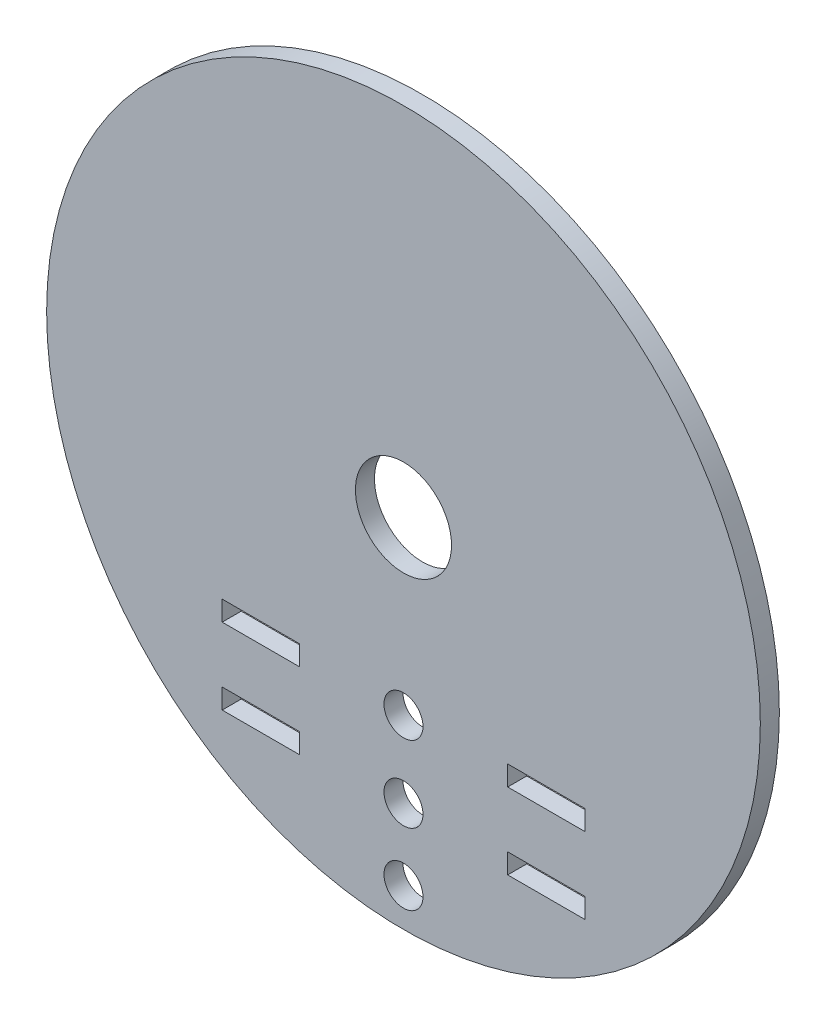
ISO-10303-21;
HEADER;
FILE_DESCRIPTION(('STEP AP214'),'2;1');
FILE_NAME('part.step','',(''),(''),'','','');
FILE_SCHEMA(('AUTOMOTIVE_DESIGN { 1 0 10303 214 1 1 1 1 }'));
ENDSEC;
DATA;
#1=APPLICATION_CONTEXT('core data for automotive mechanical design processes');
#2=APPLICATION_PROTOCOL_DEFINITION('international standard','automotive_design',2000,#1);
#3=PRODUCT_CONTEXT('',#1,'mechanical');
#4=PRODUCT('Part','Part','',(#3));
#5=PRODUCT_RELATED_PRODUCT_CATEGORY('part','',(#4));
#6=PRODUCT_DEFINITION_FORMATION('','',#4);
#7=PRODUCT_DEFINITION_CONTEXT('part definition',#1,'design');
#8=PRODUCT_DEFINITION('design','',#6,#7);
#9=PRODUCT_DEFINITION_SHAPE('','',#8);
#10=(LENGTH_UNIT() NAMED_UNIT(*) SI_UNIT(.MILLI.,.METRE.));
#11=(NAMED_UNIT(*) PLANE_ANGLE_UNIT() SI_UNIT($,.RADIAN.));
#12=(NAMED_UNIT(*) SI_UNIT($,.STERADIAN.) SOLID_ANGLE_UNIT());
#13=UNCERTAINTY_MEASURE_WITH_UNIT(LENGTH_MEASURE(1.E-05),#10,'distance_accuracy_value','');
#14=(GEOMETRIC_REPRESENTATION_CONTEXT(3) GLOBAL_UNCERTAINTY_ASSIGNED_CONTEXT((#13)) GLOBAL_UNIT_ASSIGNED_CONTEXT((#10,
#11,#12)) REPRESENTATION_CONTEXT('',''));
#15=CARTESIAN_POINT('',(0.,0.,0.));
#16=DIRECTION('',(0.,0.,1.));
#17=DIRECTION('',(1.,0.,0.));
#18=AXIS2_PLACEMENT_3D('',#15,#16,#17);
#19=CARTESIAN_POINT('',(0.,26.,2.));
#20=DIRECTION('',(0.,0.,1.));
#21=DIRECTION('',(1.,0.,0.));
#22=AXIS2_PLACEMENT_3D('',#19,#20,#21);
#23=PLANE('',#22);
#24=CARTESIAN_POINT('',(0.,-7.5,2.));
#25=DIRECTION('',(0.,0.,1.));
#26=DIRECTION('',(1.,0.,0.));
#27=AXIS2_PLACEMENT_3D('',#24,#25,#26);
#28=CIRCLE('',#27,2.05);
#29=CARTESIAN_POINT('',(2.05,-7.5,2.));
#30=VERTEX_POINT('',#29);
#31=EDGE_CURVE('E177',#30,#30,#28,.T.);
#32=ORIENTED_EDGE('',*,*,#31,.F.);
#33=EDGE_LOOP('',(#32));
#34=FACE_BOUND('',#33,.T.);
#35=CARTESIAN_POINT('',(0.,0.,2.));
#36=DIRECTION('',(0.,0.,1.));
#37=DIRECTION('',(1.,0.,0.));
#38=AXIS2_PLACEMENT_3D('',#35,#36,#37);
#39=CIRCLE('',#38,2.05);
#40=CARTESIAN_POINT('',(2.05,0.,2.));
#41=VERTEX_POINT('',#40);
#42=EDGE_CURVE('E286',#41,#41,#39,.T.);
#43=ORIENTED_EDGE('',*,*,#42,.F.);
#44=EDGE_LOOP('',(#43));
#45=FACE_BOUND('',#44,.T.);
#46=CARTESIAN_POINT('',(0.,26.,2.));
#47=DIRECTION('',(0.,0.,1.));
#48=DIRECTION('',(1.,0.,0.));
#49=AXIS2_PLACEMENT_3D('',#46,#47,#48);
#50=CIRCLE('',#49,37.5);
#51=CARTESIAN_POINT('',(37.5,26.,2.));
#52=VERTEX_POINT('',#51);
#53=EDGE_CURVE('E11',#52,#52,#50,.T.);
#54=ORIENTED_EDGE('',*,*,#53,.T.);
#55=EDGE_LOOP('',(#54));
#56=FACE_BOUND('',#55,.T.);
#57=CARTESIAN_POINT('',(0.,8.,2.));
#58=DIRECTION('',(0.,0.,1.));
#59=DIRECTION('',(1.,0.,0.));
#60=AXIS2_PLACEMENT_3D('',#57,#58,#59);
#61=CIRCLE('',#60,2.05);
#62=CARTESIAN_POINT('',(2.05,8.,2.));
#63=VERTEX_POINT('',#62);
#64=EDGE_CURVE('E280',#63,#63,#61,.T.);
#65=ORIENTED_EDGE('',*,*,#64,.F.);
#66=EDGE_LOOP('',(#65));
#67=FACE_BOUND('',#66,.T.);
#68=DIRECTION('',(-1.,0.,0.));
#69=VECTOR('',#68,1.);
#70=CARTESIAN_POINT('',(-19.05,9.05,2.));
#71=LINE('',#70,#69);
#72=CARTESIAN_POINT('',(-10.95,9.05,2.));
#73=VERTEX_POINT('',#72);
#74=CARTESIAN_POINT('',(-19.05,9.05,2.));
#75=VERTEX_POINT('',#74);
#76=EDGE_CURVE('E251',#73,#75,#71,.T.);
#77=ORIENTED_EDGE('',*,*,#76,.F.);
#78=DIRECTION('',(0.,1.,0.));
#79=VECTOR('',#78,1.);
#80=CARTESIAN_POINT('',(-10.95,9.05,2.));
#81=LINE('',#80,#79);
#82=CARTESIAN_POINT('',(-10.95,6.95,2.));
#83=VERTEX_POINT('',#82);
#84=EDGE_CURVE('E249',#83,#73,#81,.T.);
#85=ORIENTED_EDGE('',*,*,#84,.F.);
#86=DIRECTION('',(1.,0.,0.));
#87=VECTOR('',#86,1.);
#88=CARTESIAN_POINT('',(-19.05,6.95,2.));
#89=LINE('',#88,#87);
#90=CARTESIAN_POINT('',(-19.05,6.95,2.));
#91=VERTEX_POINT('',#90);
#92=EDGE_CURVE('E257',#91,#83,#89,.T.);
#93=ORIENTED_EDGE('',*,*,#92,.F.);
#94=DIRECTION('',(0.,-1.,0.));
#95=VECTOR('',#94,1.);
#96=CARTESIAN_POINT('',(-19.05,9.05,2.));
#97=LINE('',#96,#95);
#98=EDGE_CURVE('E254',#75,#91,#97,.T.);
#99=ORIENTED_EDGE('',*,*,#98,.F.);
#100=EDGE_LOOP('',(#77,#85,#93,#99));
#101=FACE_BOUND('',#100,.T.);
#102=DIRECTION('',(0.,1.,0.));
#103=VECTOR('',#102,1.);
#104=CARTESIAN_POINT('',(-10.95,-1.05,2.));
#105=LINE('',#104,#103);
#106=CARTESIAN_POINT('',(-10.95,-1.05,2.));
#107=VERTEX_POINT('',#106);
#108=CARTESIAN_POINT('',(-10.95,1.05,2.));
#109=VERTEX_POINT('',#108);
#110=EDGE_CURVE('E220',#107,#109,#105,.T.);
#111=ORIENTED_EDGE('',*,*,#110,.F.);
#112=DIRECTION('',(1.,0.,0.));
#113=VECTOR('',#112,1.);
#114=CARTESIAN_POINT('',(-19.05,-1.05,2.));
#115=LINE('',#114,#113);
#116=CARTESIAN_POINT('',(-19.05,-1.05,2.));
#117=VERTEX_POINT('',#116);
#118=EDGE_CURVE('E218',#117,#107,#115,.T.);
#119=ORIENTED_EDGE('',*,*,#118,.F.);
#120=DIRECTION('',(0.,-1.,0.));
#121=VECTOR('',#120,1.);
#122=CARTESIAN_POINT('',(-19.05,-1.05,2.));
#123=LINE('',#122,#121);
#124=CARTESIAN_POINT('',(-19.05,1.05,2.));
#125=VERTEX_POINT('',#124);
#126=EDGE_CURVE('E226',#125,#117,#123,.T.);
#127=ORIENTED_EDGE('',*,*,#126,.F.);
#128=DIRECTION('',(-1.,0.,0.));
#129=VECTOR('',#128,1.);
#130=CARTESIAN_POINT('',(-19.05,1.05,2.));
#131=LINE('',#130,#129);
#132=EDGE_CURVE('E223',#109,#125,#131,.T.);
#133=ORIENTED_EDGE('',*,*,#132,.F.);
#134=EDGE_LOOP('',(#111,#119,#127,#133));
#135=FACE_BOUND('',#134,.T.);
#136=DIRECTION('',(0.,-1.,0.));
#137=VECTOR('',#136,1.);
#138=CARTESIAN_POINT('',(10.95,9.05,2.));
#139=LINE('',#138,#137);
#140=CARTESIAN_POINT('',(10.95,9.05,2.));
#141=VERTEX_POINT('',#140);
#142=CARTESIAN_POINT('',(10.95,6.95,2.));
#143=VERTEX_POINT('',#142);
#144=EDGE_CURVE('E189',#141,#143,#139,.T.);
#145=ORIENTED_EDGE('',*,*,#144,.F.);
#146=DIRECTION('',(-1.,0.,0.));
#147=VECTOR('',#146,1.);
#148=CARTESIAN_POINT('',(19.05,9.05,2.));
#149=LINE('',#148,#147);
#150=CARTESIAN_POINT('',(19.05,9.05,2.));
#151=VERTEX_POINT('',#150);
#152=EDGE_CURVE('E187',#151,#141,#149,.T.);
#153=ORIENTED_EDGE('',*,*,#152,.F.);
#154=DIRECTION('',(0.,1.,0.));
#155=VECTOR('',#154,1.);
#156=CARTESIAN_POINT('',(19.05,9.05,2.));
#157=LINE('',#156,#155);
#158=CARTESIAN_POINT('',(19.05,6.95,2.));
#159=VERTEX_POINT('',#158);
#160=EDGE_CURVE('E195',#159,#151,#157,.T.);
#161=ORIENTED_EDGE('',*,*,#160,.F.);
#162=DIRECTION('',(1.,0.,0.));
#163=VECTOR('',#162,1.);
#164=CARTESIAN_POINT('',(19.05,6.95,2.));
#165=LINE('',#164,#163);
#166=EDGE_CURVE('E192',#143,#159,#165,.T.);
#167=ORIENTED_EDGE('',*,*,#166,.F.);
#168=EDGE_LOOP('',(#145,#153,#161,#167));
#169=FACE_BOUND('',#168,.T.);
#170=DIRECTION('',(-1.,0.,0.));
#171=VECTOR('',#170,1.);
#172=CARTESIAN_POINT('',(19.05,1.05,2.));
#173=LINE('',#172,#171);
#174=CARTESIAN_POINT('',(19.05,1.05,2.));
#175=VERTEX_POINT('',#174);
#176=CARTESIAN_POINT('',(10.95,1.05,2.));
#177=VERTEX_POINT('',#176);
#178=EDGE_CURVE('E156',#175,#177,#173,.T.);
#179=ORIENTED_EDGE('',*,*,#178,.F.);
#180=DIRECTION('',(0.,1.,0.));
#181=VECTOR('',#180,1.);
#182=CARTESIAN_POINT('',(19.05,-1.05,2.));
#183=LINE('',#182,#181);
#184=CARTESIAN_POINT('',(19.05,-1.05,2.));
#185=VERTEX_POINT('',#184);
#186=EDGE_CURVE('E148',#185,#175,#183,.T.);
#187=ORIENTED_EDGE('',*,*,#186,.F.);
#188=DIRECTION('',(1.,0.,0.));
#189=VECTOR('',#188,1.);
#190=CARTESIAN_POINT('',(19.05,-1.05,2.));
#191=LINE('',#190,#189);
#192=CARTESIAN_POINT('',(10.95,-1.05,2.));
#193=VERTEX_POINT('',#192);
#194=EDGE_CURVE('E171',#193,#185,#191,.T.);
#195=ORIENTED_EDGE('',*,*,#194,.F.);
#196=DIRECTION('',(0.,-1.,0.));
#197=VECTOR('',#196,1.);
#198=CARTESIAN_POINT('',(10.95,-1.05,2.));
#199=LINE('',#198,#197);
#200=EDGE_CURVE('E169',#177,#193,#199,.T.);
#201=ORIENTED_EDGE('',*,*,#200,.F.);
#202=EDGE_LOOP('',(#179,#187,#195,#201));
#203=FACE_BOUND('',#202,.T.);
#204=CARTESIAN_POINT('',(0.,26.,2.));
#205=DIRECTION('',(0.,0.,1.));
#206=DIRECTION('',(1.,0.,0.));
#207=AXIS2_PLACEMENT_3D('',#204,#205,#206);
#208=CIRCLE('',#207,5.05);
#209=CARTESIAN_POINT('',(5.05,26.,2.));
#210=VERTEX_POINT('',#209);
#211=EDGE_CURVE('E511',#210,#210,#208,.T.);
#212=ORIENTED_EDGE('',*,*,#211,.F.);
#213=EDGE_LOOP('',(#212));
#214=FACE_BOUND('',#213,.T.);
#215=ADVANCED_FACE('F35',(#34,#45,#56,#67,#101,#135,#169,#203,#214),#23,.T.);
#216=CARTESIAN_POINT('',(0.,26.,0.));
#217=DIRECTION('',(0.,0.,1.));
#218=DIRECTION('',(1.,0.,0.));
#219=AXIS2_PLACEMENT_3D('',#216,#217,#218);
#220=PLANE('',#219);
#221=DIRECTION('',(-1.,0.,0.));
#222=VECTOR('',#221,1.);
#223=CARTESIAN_POINT('',(19.05,9.05,0.));
#224=LINE('',#223,#222);
#225=CARTESIAN_POINT('',(19.05,9.05,0.));
#226=VERTEX_POINT('',#225);
#227=CARTESIAN_POINT('',(10.95,9.05,0.));
#228=VERTEX_POINT('',#227);
#229=EDGE_CURVE('E164',#226,#228,#224,.T.);
#230=ORIENTED_EDGE('',*,*,#229,.T.);
#231=DIRECTION('',(0.,-1.,0.));
#232=VECTOR('',#231,1.);
#233=CARTESIAN_POINT('',(10.95,9.05,0.));
#234=LINE('',#233,#232);
#235=CARTESIAN_POINT('',(10.95,6.95,0.));
#236=VERTEX_POINT('',#235);
#237=EDGE_CURVE('E200',#228,#236,#234,.T.);
#238=ORIENTED_EDGE('',*,*,#237,.T.);
#239=DIRECTION('',(1.,0.,0.));
#240=VECTOR('',#239,1.);
#241=CARTESIAN_POINT('',(19.05,6.95,0.));
#242=LINE('',#241,#240);
#243=CARTESIAN_POINT('',(19.05,6.95,0.));
#244=VERTEX_POINT('',#243);
#245=EDGE_CURVE('E203',#236,#244,#242,.T.);
#246=ORIENTED_EDGE('',*,*,#245,.T.);
#247=DIRECTION('',(0.,1.,0.));
#248=VECTOR('',#247,1.);
#249=CARTESIAN_POINT('',(19.05,9.05,0.));
#250=LINE('',#249,#248);
#251=EDGE_CURVE('E190',#244,#226,#250,.T.);
#252=ORIENTED_EDGE('',*,*,#251,.T.);
#253=EDGE_LOOP('',(#230,#238,#246,#252));
#254=FACE_BOUND('',#253,.T.);
#255=DIRECTION('',(0.,1.,0.));
#256=VECTOR('',#255,1.);
#257=CARTESIAN_POINT('',(-10.95,9.05,0.));
#258=LINE('',#257,#256);
#259=CARTESIAN_POINT('',(-10.95,6.95,0.));
#260=VERTEX_POINT('',#259);
#261=CARTESIAN_POINT('',(-10.95,9.05,0.));
#262=VERTEX_POINT('',#261);
#263=EDGE_CURVE('E248',#260,#262,#258,.T.);
#264=ORIENTED_EDGE('',*,*,#263,.T.);
#265=DIRECTION('',(-1.,0.,0.));
#266=VECTOR('',#265,1.);
#267=CARTESIAN_POINT('',(-19.05,9.05,0.));
#268=LINE('',#267,#266);
#269=CARTESIAN_POINT('',(-19.05,9.05,0.));
#270=VERTEX_POINT('',#269);
#271=EDGE_CURVE('E262',#262,#270,#268,.T.);
#272=ORIENTED_EDGE('',*,*,#271,.T.);
#273=DIRECTION('',(0.,-1.,0.));
#274=VECTOR('',#273,1.);
#275=CARTESIAN_POINT('',(-19.05,9.05,0.));
#276=LINE('',#275,#274);
#277=CARTESIAN_POINT('',(-19.05,6.95,0.));
#278=VERTEX_POINT('',#277);
#279=EDGE_CURVE('E265',#270,#278,#276,.T.);
#280=ORIENTED_EDGE('',*,*,#279,.T.);
#281=DIRECTION('',(1.,0.,0.));
#282=VECTOR('',#281,1.);
#283=CARTESIAN_POINT('',(-19.05,6.95,0.));
#284=LINE('',#283,#282);
#285=EDGE_CURVE('E252',#278,#260,#284,.T.);
#286=ORIENTED_EDGE('',*,*,#285,.T.);
#287=EDGE_LOOP('',(#264,#272,#280,#286));
#288=FACE_BOUND('',#287,.T.);
#289=CARTESIAN_POINT('',(0.,26.,0.));
#290=DIRECTION('',(0.,0.,1.));
#291=DIRECTION('',(1.,0.,0.));
#292=AXIS2_PLACEMENT_3D('',#289,#290,#291);
#293=CIRCLE('',#292,37.5);
#294=CARTESIAN_POINT('',(37.5,26.,0.));
#295=VERTEX_POINT('',#294);
#296=EDGE_CURVE('E39',#295,#295,#293,.T.);
#297=ORIENTED_EDGE('',*,*,#296,.F.);
#298=EDGE_LOOP('',(#297));
#299=FACE_BOUND('',#298,.T.);
#300=CARTESIAN_POINT('',(0.,0.,0.));
#301=DIRECTION('',(0.,0.,1.));
#302=DIRECTION('',(1.,0.,0.));
#303=AXIS2_PLACEMENT_3D('',#300,#301,#302);
#304=CIRCLE('',#303,2.05);
#305=CARTESIAN_POINT('',(2.05,0.,0.));
#306=VERTEX_POINT('',#305);
#307=EDGE_CURVE('E283',#306,#306,#304,.T.);
#308=ORIENTED_EDGE('',*,*,#307,.T.);
#309=EDGE_LOOP('',(#308));
#310=FACE_BOUND('',#309,.T.);
#311=CARTESIAN_POINT('',(0.,8.,0.));
#312=DIRECTION('',(0.,0.,1.));
#313=DIRECTION('',(1.,0.,0.));
#314=AXIS2_PLACEMENT_3D('',#311,#312,#313);
#315=CIRCLE('',#314,2.05);
#316=CARTESIAN_POINT('',(2.05,8.,0.));
#317=VERTEX_POINT('',#316);
#318=EDGE_CURVE('E279',#317,#317,#315,.T.);
#319=ORIENTED_EDGE('',*,*,#318,.T.);
#320=EDGE_LOOP('',(#319));
#321=FACE_BOUND('',#320,.T.);
#322=DIRECTION('',(1.,0.,0.));
#323=VECTOR('',#322,1.);
#324=CARTESIAN_POINT('',(-19.05,-1.05,0.));
#325=LINE('',#324,#323);
#326=CARTESIAN_POINT('',(-19.05,-1.05,0.));
#327=VERTEX_POINT('',#326);
#328=CARTESIAN_POINT('',(-10.95,-1.05,0.));
#329=VERTEX_POINT('',#328);
#330=EDGE_CURVE('E217',#327,#329,#325,.T.);
#331=ORIENTED_EDGE('',*,*,#330,.T.);
#332=DIRECTION('',(0.,1.,0.));
#333=VECTOR('',#332,1.);
#334=CARTESIAN_POINT('',(-10.95,-1.05,0.));
#335=LINE('',#334,#333);
#336=CARTESIAN_POINT('',(-10.95,1.05,0.));
#337=VERTEX_POINT('',#336);
#338=EDGE_CURVE('E231',#329,#337,#335,.T.);
#339=ORIENTED_EDGE('',*,*,#338,.T.);
#340=DIRECTION('',(-1.,0.,0.));
#341=VECTOR('',#340,1.);
#342=CARTESIAN_POINT('',(-19.05,1.05,0.));
#343=LINE('',#342,#341);
#344=CARTESIAN_POINT('',(-19.05,1.05,0.));
#345=VERTEX_POINT('',#344);
#346=EDGE_CURVE('E234',#337,#345,#343,.T.);
#347=ORIENTED_EDGE('',*,*,#346,.T.);
#348=DIRECTION('',(0.,-1.,0.));
#349=VECTOR('',#348,1.);
#350=CARTESIAN_POINT('',(-19.05,-1.05,0.));
#351=LINE('',#350,#349);
#352=EDGE_CURVE('E221',#345,#327,#351,.T.);
#353=ORIENTED_EDGE('',*,*,#352,.T.);
#354=EDGE_LOOP('',(#331,#339,#347,#353));
#355=FACE_BOUND('',#354,.T.);
#356=DIRECTION('',(0.,1.,0.));
#357=VECTOR('',#356,1.);
#358=CARTESIAN_POINT('',(19.05,-1.05,0.));
#359=LINE('',#358,#357);
#360=CARTESIAN_POINT('',(19.05,-1.05,0.));
#361=VERTEX_POINT('',#360);
#362=CARTESIAN_POINT('',(19.05,1.05,0.));
#363=VERTEX_POINT('',#362);
#364=EDGE_CURVE('E58',#361,#363,#359,.T.);
#365=ORIENTED_EDGE('',*,*,#364,.T.);
#366=DIRECTION('',(-1.,0.,0.));
#367=VECTOR('',#366,1.);
#368=CARTESIAN_POINT('',(19.05,1.05,0.));
#369=LINE('',#368,#367);
#370=CARTESIAN_POINT('',(10.95,1.05,0.));
#371=VERTEX_POINT('',#370);
#372=EDGE_CURVE('E163',#363,#371,#369,.T.);
#373=ORIENTED_EDGE('',*,*,#372,.T.);
#374=DIRECTION('',(0.,-1.,0.));
#375=VECTOR('',#374,1.);
#376=CARTESIAN_POINT('',(10.95,-1.05,0.));
#377=LINE('',#376,#375);
#378=CARTESIAN_POINT('',(10.95,-1.05,0.));
#379=VERTEX_POINT('',#378);
#380=EDGE_CURVE('E179',#371,#379,#377,.T.);
#381=ORIENTED_EDGE('',*,*,#380,.T.);
#382=DIRECTION('',(1.,0.,0.));
#383=VECTOR('',#382,1.);
#384=CARTESIAN_POINT('',(19.05,-1.05,0.));
#385=LINE('',#384,#383);
#386=EDGE_CURVE('E157',#379,#361,#385,.T.);
#387=ORIENTED_EDGE('',*,*,#386,.T.);
#388=EDGE_LOOP('',(#365,#373,#381,#387));
#389=FACE_BOUND('',#388,.T.);
#390=CARTESIAN_POINT('',(0.,-7.5,0.));
#391=DIRECTION('',(0.,0.,1.));
#392=DIRECTION('',(1.,0.,0.));
#393=AXIS2_PLACEMENT_3D('',#390,#391,#392);
#394=CIRCLE('',#393,2.05);
#395=CARTESIAN_POINT('',(2.05,-7.5,0.));
#396=VERTEX_POINT('',#395);
#397=EDGE_CURVE('E517',#396,#396,#394,.T.);
#398=ORIENTED_EDGE('',*,*,#397,.T.);
#399=EDGE_LOOP('',(#398));
#400=FACE_BOUND('',#399,.T.);
#401=CARTESIAN_POINT('',(0.,26.,0.));
#402=DIRECTION('',(0.,0.,1.));
#403=DIRECTION('',(1.,0.,0.));
#404=AXIS2_PLACEMENT_3D('',#401,#402,#403);
#405=CIRCLE('',#404,5.05);
#406=CARTESIAN_POINT('',(5.05,26.,0.));
#407=VERTEX_POINT('',#406);
#408=EDGE_CURVE('E514',#407,#407,#405,.T.);
#409=ORIENTED_EDGE('',*,*,#408,.T.);
#410=EDGE_LOOP('',(#409));
#411=FACE_BOUND('',#410,.T.);
#412=ADVANCED_FACE('F292',(#254,#288,#299,#310,#321,#355,#389,#400,#411),#220,.F.);
#413=CARTESIAN_POINT('',(0.,26.,2.));
#414=DIRECTION('',(0.,0.,-1.));
#415=DIRECTION('',(-1.,0.,0.));
#416=AXIS2_PLACEMENT_3D('',#413,#414,#415);
#417=CYLINDRICAL_SURFACE('',#416,37.5);
#418=ORIENTED_EDGE('',*,*,#53,.F.);
#419=EDGE_LOOP('',(#418));
#420=FACE_BOUND('',#419,.T.);
#421=ORIENTED_EDGE('',*,*,#296,.T.);
#422=EDGE_LOOP('',(#421));
#423=FACE_BOUND('',#422,.T.);
#424=ADVANCED_FACE('F37',(#420,#423),#417,.T.);
#425=CARTESIAN_POINT('',(0.,0.,2.));
#426=DIRECTION('',(0.,0.,-1.));
#427=DIRECTION('',(-1.,0.,0.));
#428=AXIS2_PLACEMENT_3D('',#425,#426,#427);
#429=CYLINDRICAL_SURFACE('',#428,2.05);
#430=ORIENTED_EDGE('',*,*,#42,.T.);
#431=EDGE_LOOP('',(#430));
#432=FACE_BOUND('',#431,.T.);
#433=ORIENTED_EDGE('',*,*,#307,.F.);
#434=EDGE_LOOP('',(#433));
#435=FACE_BOUND('',#434,.T.);
#436=ADVANCED_FACE('F295',(#432,#435),#429,.F.);
#437=CARTESIAN_POINT('',(0.,8.,2.));
#438=DIRECTION('',(0.,0.,-1.));
#439=DIRECTION('',(-1.,0.,0.));
#440=AXIS2_PLACEMENT_3D('',#437,#438,#439);
#441=CYLINDRICAL_SURFACE('',#440,2.05);
#442=ORIENTED_EDGE('',*,*,#64,.T.);
#443=EDGE_LOOP('',(#442));
#444=FACE_BOUND('',#443,.T.);
#445=ORIENTED_EDGE('',*,*,#318,.F.);
#446=EDGE_LOOP('',(#445));
#447=FACE_BOUND('',#446,.T.);
#448=ADVANCED_FACE('F297',(#444,#447),#441,.F.);
#449=CARTESIAN_POINT('',(-10.95,9.05,2.));
#450=DIRECTION('',(-1.,0.,0.));
#451=DIRECTION('',(0.,0.,1.));
#452=AXIS2_PLACEMENT_3D('',#449,#450,#451);
#453=PLANE('',#452);
#454=ORIENTED_EDGE('',*,*,#263,.F.);
#455=DIRECTION('',(0.,0.,-1.));
#456=VECTOR('',#455,1.);
#457=CARTESIAN_POINT('',(-10.95,6.95,2.));
#458=LINE('',#457,#456);
#459=EDGE_CURVE('E259',#83,#260,#458,.T.);
#460=ORIENTED_EDGE('',*,*,#459,.F.);
#461=ORIENTED_EDGE('',*,*,#84,.T.);
#462=DIRECTION('',(0.,0.,-1.));
#463=VECTOR('',#462,1.);
#464=CARTESIAN_POINT('',(-10.95,9.05,2.));
#465=LINE('',#464,#463);
#466=EDGE_CURVE('E276',#73,#262,#465,.T.);
#467=ORIENTED_EDGE('',*,*,#466,.T.);
#468=EDGE_LOOP('',(#454,#460,#461,#467));
#469=FACE_BOUND('',#468,.T.);
#470=ADVANCED_FACE('F304',(#469),#453,.T.);
#471=CARTESIAN_POINT('',(-19.05,9.05,2.));
#472=DIRECTION('',(0.,-1.,0.));
#473=DIRECTION('',(0.,0.,-1.));
#474=AXIS2_PLACEMENT_3D('',#471,#472,#473);
#475=PLANE('',#474);
#476=ORIENTED_EDGE('',*,*,#271,.F.);
#477=ORIENTED_EDGE('',*,*,#466,.F.);
#478=ORIENTED_EDGE('',*,*,#76,.T.);
#479=DIRECTION('',(0.,0.,-1.));
#480=VECTOR('',#479,1.);
#481=CARTESIAN_POINT('',(-19.05,9.05,2.));
#482=LINE('',#481,#480);
#483=EDGE_CURVE('E274',#75,#270,#482,.T.);
#484=ORIENTED_EDGE('',*,*,#483,.T.);
#485=EDGE_LOOP('',(#476,#477,#478,#484));
#486=FACE_BOUND('',#485,.T.);
#487=ADVANCED_FACE('F387',(#486),#475,.T.);
#488=CARTESIAN_POINT('',(-19.05,9.05,2.));
#489=DIRECTION('',(1.,0.,0.));
#490=DIRECTION('',(0.,0.,-1.));
#491=AXIS2_PLACEMENT_3D('',#488,#489,#490);
#492=PLANE('',#491);
#493=ORIENTED_EDGE('',*,*,#279,.F.);
#494=ORIENTED_EDGE('',*,*,#483,.F.);
#495=ORIENTED_EDGE('',*,*,#98,.T.);
#496=DIRECTION('',(0.,0.,-1.));
#497=VECTOR('',#496,1.);
#498=CARTESIAN_POINT('',(-19.05,6.95,2.));
#499=LINE('',#498,#497);
#500=EDGE_CURVE('E272',#91,#278,#499,.T.);
#501=ORIENTED_EDGE('',*,*,#500,.T.);
#502=EDGE_LOOP('',(#493,#494,#495,#501));
#503=FACE_BOUND('',#502,.T.);
#504=ADVANCED_FACE('F383',(#503),#492,.T.);
#505=CARTESIAN_POINT('',(-19.05,6.95,2.));
#506=DIRECTION('',(0.,1.,0.));
#507=DIRECTION('',(0.,0.,1.));
#508=AXIS2_PLACEMENT_3D('',#505,#506,#507);
#509=PLANE('',#508);
#510=ORIENTED_EDGE('',*,*,#285,.F.);
#511=ORIENTED_EDGE('',*,*,#500,.F.);
#512=ORIENTED_EDGE('',*,*,#92,.T.);
#513=ORIENTED_EDGE('',*,*,#459,.T.);
#514=EDGE_LOOP('',(#510,#511,#512,#513));
#515=FACE_BOUND('',#514,.T.);
#516=ADVANCED_FACE('F379',(#515),#509,.T.);
#517=CARTESIAN_POINT('',(-19.05,-1.05,2.));
#518=DIRECTION('',(0.,1.,0.));
#519=DIRECTION('',(0.,0.,1.));
#520=AXIS2_PLACEMENT_3D('',#517,#518,#519);
#521=PLANE('',#520);
#522=ORIENTED_EDGE('',*,*,#330,.F.);
#523=DIRECTION('',(0.,0.,-1.));
#524=VECTOR('',#523,1.);
#525=CARTESIAN_POINT('',(-19.05,-1.05,2.));
#526=LINE('',#525,#524);
#527=EDGE_CURVE('E228',#117,#327,#526,.T.);
#528=ORIENTED_EDGE('',*,*,#527,.F.);
#529=ORIENTED_EDGE('',*,*,#118,.T.);
#530=DIRECTION('',(0.,0.,-1.));
#531=VECTOR('',#530,1.);
#532=CARTESIAN_POINT('',(-10.95,-1.05,2.));
#533=LINE('',#532,#531);
#534=EDGE_CURVE('E245',#107,#329,#533,.T.);
#535=ORIENTED_EDGE('',*,*,#534,.T.);
#536=EDGE_LOOP('',(#522,#528,#529,#535));
#537=FACE_BOUND('',#536,.T.);
#538=ADVANCED_FACE('F375',(#537),#521,.T.);
#539=CARTESIAN_POINT('',(-10.95,-1.05,2.));
#540=DIRECTION('',(-1.,0.,0.));
#541=DIRECTION('',(0.,0.,1.));
#542=AXIS2_PLACEMENT_3D('',#539,#540,#541);
#543=PLANE('',#542);
#544=ORIENTED_EDGE('',*,*,#338,.F.);
#545=ORIENTED_EDGE('',*,*,#534,.F.);
#546=ORIENTED_EDGE('',*,*,#110,.T.);
#547=DIRECTION('',(0.,0.,-1.));
#548=VECTOR('',#547,1.);
#549=CARTESIAN_POINT('',(-10.95,1.05,2.));
#550=LINE('',#549,#548);
#551=EDGE_CURVE('E243',#109,#337,#550,.T.);
#552=ORIENTED_EDGE('',*,*,#551,.T.);
#553=EDGE_LOOP('',(#544,#545,#546,#552));
#554=FACE_BOUND('',#553,.T.);
#555=ADVANCED_FACE('F371',(#554),#543,.T.);
#556=CARTESIAN_POINT('',(-19.05,1.05,2.));
#557=DIRECTION('',(0.,-1.,0.));
#558=DIRECTION('',(0.,0.,-1.));
#559=AXIS2_PLACEMENT_3D('',#556,#557,#558);
#560=PLANE('',#559);
#561=ORIENTED_EDGE('',*,*,#346,.F.);
#562=ORIENTED_EDGE('',*,*,#551,.F.);
#563=ORIENTED_EDGE('',*,*,#132,.T.);
#564=DIRECTION('',(0.,0.,-1.));
#565=VECTOR('',#564,1.);
#566=CARTESIAN_POINT('',(-19.05,1.05,2.));
#567=LINE('',#566,#565);
#568=EDGE_CURVE('E241',#125,#345,#567,.T.);
#569=ORIENTED_EDGE('',*,*,#568,.T.);
#570=EDGE_LOOP('',(#561,#562,#563,#569));
#571=FACE_BOUND('',#570,.T.);
#572=ADVANCED_FACE('F367',(#571),#560,.T.);
#573=CARTESIAN_POINT('',(-19.05,-1.05,2.));
#574=DIRECTION('',(1.,0.,0.));
#575=DIRECTION('',(0.,0.,-1.));
#576=AXIS2_PLACEMENT_3D('',#573,#574,#575);
#577=PLANE('',#576);
#578=ORIENTED_EDGE('',*,*,#352,.F.);
#579=ORIENTED_EDGE('',*,*,#568,.F.);
#580=ORIENTED_EDGE('',*,*,#126,.T.);
#581=ORIENTED_EDGE('',*,*,#527,.T.);
#582=EDGE_LOOP('',(#578,#579,#580,#581));
#583=FACE_BOUND('',#582,.T.);
#584=ADVANCED_FACE('F364',(#583),#577,.T.);
#585=CARTESIAN_POINT('',(19.05,9.05,2.));
#586=DIRECTION('',(0.,-1.,0.));
#587=DIRECTION('',(0.,0.,-1.));
#588=AXIS2_PLACEMENT_3D('',#585,#586,#587);
#589=PLANE('',#588);
#590=ORIENTED_EDGE('',*,*,#229,.F.);
#591=DIRECTION('',(0.,0.,-1.));
#592=VECTOR('',#591,1.);
#593=CARTESIAN_POINT('',(19.05,9.05,2.));
#594=LINE('',#593,#592);
#595=EDGE_CURVE('E197',#151,#226,#594,.T.);
#596=ORIENTED_EDGE('',*,*,#595,.F.);
#597=ORIENTED_EDGE('',*,*,#152,.T.);
#598=DIRECTION('',(0.,0.,-1.));
#599=VECTOR('',#598,1.);
#600=CARTESIAN_POINT('',(10.95,9.05,2.));
#601=LINE('',#600,#599);
#602=EDGE_CURVE('E214',#141,#228,#601,.T.);
#603=ORIENTED_EDGE('',*,*,#602,.T.);
#604=EDGE_LOOP('',(#590,#596,#597,#603));
#605=FACE_BOUND('',#604,.T.);
#606=ADVANCED_FACE('F346',(#605),#589,.T.);
#607=CARTESIAN_POINT('',(10.95,9.05,2.));
#608=DIRECTION('',(1.,0.,0.));
#609=DIRECTION('',(0.,0.,-1.));
#610=AXIS2_PLACEMENT_3D('',#607,#608,#609);
#611=PLANE('',#610);
#612=ORIENTED_EDGE('',*,*,#237,.F.);
#613=ORIENTED_EDGE('',*,*,#602,.F.);
#614=ORIENTED_EDGE('',*,*,#144,.T.);
#615=DIRECTION('',(0.,0.,-1.));
#616=VECTOR('',#615,1.);
#617=CARTESIAN_POINT('',(10.95,6.95,2.));
#618=LINE('',#617,#616);
#619=EDGE_CURVE('E212',#143,#236,#618,.T.);
#620=ORIENTED_EDGE('',*,*,#619,.T.);
#621=EDGE_LOOP('',(#612,#613,#614,#620));
#622=FACE_BOUND('',#621,.T.);
#623=ADVANCED_FACE('F339',(#622),#611,.T.);
#624=CARTESIAN_POINT('',(19.05,6.95,2.));
#625=DIRECTION('',(0.,1.,0.));
#626=DIRECTION('',(0.,0.,1.));
#627=AXIS2_PLACEMENT_3D('',#624,#625,#626);
#628=PLANE('',#627);
#629=ORIENTED_EDGE('',*,*,#245,.F.);
#630=ORIENTED_EDGE('',*,*,#619,.F.);
#631=ORIENTED_EDGE('',*,*,#166,.T.);
#632=DIRECTION('',(0.,0.,-1.));
#633=VECTOR('',#632,1.);
#634=CARTESIAN_POINT('',(19.05,6.95,2.));
#635=LINE('',#634,#633);
#636=EDGE_CURVE('E210',#159,#244,#635,.T.);
#637=ORIENTED_EDGE('',*,*,#636,.T.);
#638=EDGE_LOOP('',(#629,#630,#631,#637));
#639=FACE_BOUND('',#638,.T.);
#640=ADVANCED_FACE('F342',(#639),#628,.T.);
#641=CARTESIAN_POINT('',(19.05,9.05,2.));
#642=DIRECTION('',(-1.,0.,0.));
#643=DIRECTION('',(0.,0.,1.));
#644=AXIS2_PLACEMENT_3D('',#641,#642,#643);
#645=PLANE('',#644);
#646=ORIENTED_EDGE('',*,*,#251,.F.);
#647=ORIENTED_EDGE('',*,*,#636,.F.);
#648=ORIENTED_EDGE('',*,*,#160,.T.);
#649=ORIENTED_EDGE('',*,*,#595,.T.);
#650=EDGE_LOOP('',(#646,#647,#648,#649));
#651=FACE_BOUND('',#650,.T.);
#652=ADVANCED_FACE('F349',(#651),#645,.T.);
#653=CARTESIAN_POINT('',(19.05,-1.05,2.));
#654=DIRECTION('',(-1.,0.,0.));
#655=DIRECTION('',(0.,0.,1.));
#656=AXIS2_PLACEMENT_3D('',#653,#654,#655);
#657=PLANE('',#656);
#658=ORIENTED_EDGE('',*,*,#364,.F.);
#659=DIRECTION('',(0.,0.,-1.));
#660=VECTOR('',#659,1.);
#661=CARTESIAN_POINT('',(19.05,-1.05,2.));
#662=LINE('',#661,#660);
#663=EDGE_CURVE('E152',#185,#361,#662,.T.);
#664=ORIENTED_EDGE('',*,*,#663,.F.);
#665=ORIENTED_EDGE('',*,*,#186,.T.);
#666=DIRECTION('',(0.,0.,-1.));
#667=VECTOR('',#666,1.);
#668=CARTESIAN_POINT('',(19.05,1.05,2.));
#669=LINE('',#668,#667);
#670=EDGE_CURVE('E151',#175,#363,#669,.T.);
#671=ORIENTED_EDGE('',*,*,#670,.T.);
#672=EDGE_LOOP('',(#658,#664,#665,#671));
#673=FACE_BOUND('',#672,.T.);
#674=ADVANCED_FACE('F150',(#673),#657,.T.);
#675=CARTESIAN_POINT('',(19.05,1.05,2.));
#676=DIRECTION('',(0.,-1.,0.));
#677=DIRECTION('',(0.,0.,-1.));
#678=AXIS2_PLACEMENT_3D('',#675,#676,#677);
#679=PLANE('',#678);
#680=ORIENTED_EDGE('',*,*,#372,.F.);
#681=ORIENTED_EDGE('',*,*,#670,.F.);
#682=ORIENTED_EDGE('',*,*,#178,.T.);
#683=DIRECTION('',(0.,0.,-1.));
#684=VECTOR('',#683,1.);
#685=CARTESIAN_POINT('',(10.95,1.05,2.));
#686=LINE('',#685,#684);
#687=EDGE_CURVE('E165',#177,#371,#686,.T.);
#688=ORIENTED_EDGE('',*,*,#687,.T.);
#689=EDGE_LOOP('',(#680,#681,#682,#688));
#690=FACE_BOUND('',#689,.T.);
#691=ADVANCED_FACE('F160',(#690),#679,.T.);
#692=CARTESIAN_POINT('',(10.95,-1.05,2.));
#693=DIRECTION('',(1.,0.,0.));
#694=DIRECTION('',(0.,0.,-1.));
#695=AXIS2_PLACEMENT_3D('',#692,#693,#694);
#696=PLANE('',#695);
#697=ORIENTED_EDGE('',*,*,#380,.F.);
#698=ORIENTED_EDGE('',*,*,#687,.F.);
#699=ORIENTED_EDGE('',*,*,#200,.T.);
#700=DIRECTION('',(0.,0.,-1.));
#701=VECTOR('',#700,1.);
#702=CARTESIAN_POINT('',(10.95,-1.05,2.));
#703=LINE('',#702,#701);
#704=EDGE_CURVE('E50',#193,#379,#703,.T.);
#705=ORIENTED_EDGE('',*,*,#704,.T.);
#706=EDGE_LOOP('',(#697,#698,#699,#705));
#707=FACE_BOUND('',#706,.T.);
#708=ADVANCED_FACE('F467',(#707),#696,.T.);
#709=CARTESIAN_POINT('',(19.05,-1.05,2.));
#710=DIRECTION('',(0.,1.,0.));
#711=DIRECTION('',(0.,0.,1.));
#712=AXIS2_PLACEMENT_3D('',#709,#710,#711);
#713=PLANE('',#712);
#714=ORIENTED_EDGE('',*,*,#386,.F.);
#715=ORIENTED_EDGE('',*,*,#704,.F.);
#716=ORIENTED_EDGE('',*,*,#194,.T.);
#717=ORIENTED_EDGE('',*,*,#663,.T.);
#718=EDGE_LOOP('',(#714,#715,#716,#717));
#719=FACE_BOUND('',#718,.T.);
#720=ADVANCED_FACE('F475',(#719),#713,.T.);
#721=CARTESIAN_POINT('',(0.,-7.5,2.));
#722=DIRECTION('',(0.,0.,-1.));
#723=DIRECTION('',(-1.,0.,0.));
#724=AXIS2_PLACEMENT_3D('',#721,#722,#723);
#725=CYLINDRICAL_SURFACE('',#724,2.05);
#726=ORIENTED_EDGE('',*,*,#31,.T.);
#727=EDGE_LOOP('',(#726));
#728=FACE_BOUND('',#727,.T.);
#729=ORIENTED_EDGE('',*,*,#397,.F.);
#730=EDGE_LOOP('',(#729));
#731=FACE_BOUND('',#730,.T.);
#732=ADVANCED_FACE('F485',(#728,#731),#725,.F.);
#733=CARTESIAN_POINT('',(0.,26.,2.));
#734=DIRECTION('',(0.,0.,-1.));
#735=DIRECTION('',(-1.,0.,0.));
#736=AXIS2_PLACEMENT_3D('',#733,#734,#735);
#737=CYLINDRICAL_SURFACE('',#736,5.05);
#738=ORIENTED_EDGE('',*,*,#211,.T.);
#739=EDGE_LOOP('',(#738));
#740=FACE_BOUND('',#739,.T.);
#741=ORIENTED_EDGE('',*,*,#408,.F.);
#742=EDGE_LOOP('',(#741));
#743=FACE_BOUND('',#742,.T.);
#744=ADVANCED_FACE('F494',(#740,#743),#737,.F.);
#745=CLOSED_SHELL('',(#215,#412,#424,#436,#448,#470,#487,#504,#516,#538,#555,#572,#584,#606,
#623,#640,#652,#674,#691,#708,#720,#732,#744));
#746=MANIFOLD_SOLID_BREP('B2',#745);
#747=ADVANCED_BREP_SHAPE_REPRESENTATION('',(#18,#746),#14);
#748=SHAPE_DEFINITION_REPRESENTATION(#9,#747);
ENDSEC;
END-ISO-10303-21;
